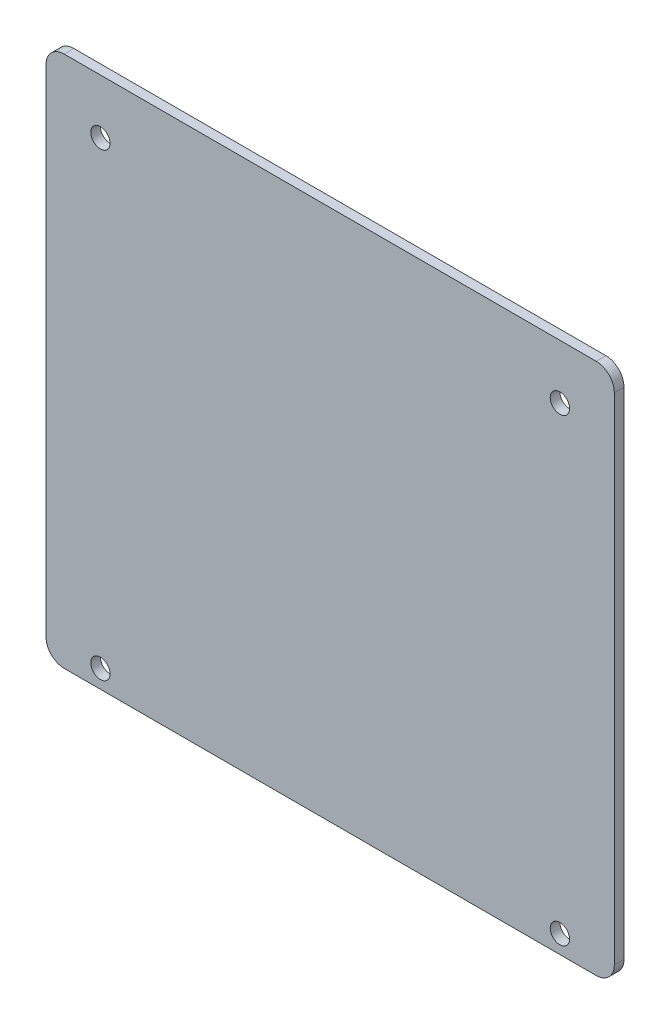
ISO-10303-21;
HEADER;
FILE_DESCRIPTION(('STEP AP214'),'2;1');
FILE_NAME('part.step','',(''),(''),'','','');
FILE_SCHEMA(('AUTOMOTIVE_DESIGN { 1 0 10303 214 1 1 1 1 }'));
ENDSEC;
DATA;
#1=APPLICATION_CONTEXT('core data for automotive mechanical design processes');
#2=APPLICATION_PROTOCOL_DEFINITION('international standard','automotive_design',2000,#1);
#3=PRODUCT_CONTEXT('',#1,'mechanical');
#4=PRODUCT('Part','Part','',(#3));
#5=PRODUCT_RELATED_PRODUCT_CATEGORY('part','',(#4));
#6=PRODUCT_DEFINITION_FORMATION('','',#4);
#7=PRODUCT_DEFINITION_CONTEXT('part definition',#1,'design');
#8=PRODUCT_DEFINITION('design','',#6,#7);
#9=PRODUCT_DEFINITION_SHAPE('','',#8);
#10=(LENGTH_UNIT() NAMED_UNIT(*) SI_UNIT(.MILLI.,.METRE.));
#11=(NAMED_UNIT(*) PLANE_ANGLE_UNIT() SI_UNIT($,.RADIAN.));
#12=(NAMED_UNIT(*) SI_UNIT($,.STERADIAN.) SOLID_ANGLE_UNIT());
#13=UNCERTAINTY_MEASURE_WITH_UNIT(LENGTH_MEASURE(1.E-05),#10,'distance_accuracy_value','');
#14=(GEOMETRIC_REPRESENTATION_CONTEXT(3) GLOBAL_UNCERTAINTY_ASSIGNED_CONTEXT((#13)) GLOBAL_UNIT_ASSIGNED_CONTEXT((#10,
#11,#12)) REPRESENTATION_CONTEXT('',''));
#15=CARTESIAN_POINT('',(0.,0.,0.));
#16=DIRECTION('',(0.,0.,1.));
#17=DIRECTION('',(1.,0.,0.));
#18=AXIS2_PLACEMENT_3D('',#15,#16,#17);
#19=CARTESIAN_POINT('',(-84.5653438799531,88.9518569300749,0.));
#20=DIRECTION('',(0.,0.,1.));
#21=DIRECTION('',(1.,0.,0.));
#22=AXIS2_PLACEMENT_3D('',#19,#20,#21);
#23=PLANE('',#22);
#24=CARTESIAN_POINT('',(-78.5653438799532,82.9518569300749,0.));
#25=DIRECTION('',(0.,0.,-1.));
#26=DIRECTION('',(-1.,0.,0.));
#27=AXIS2_PLACEMENT_3D('',#24,#25,#26);
#28=CIRCLE('',#27,1.59999999999999);
#29=CARTESIAN_POINT('',(-80.1653438799532,82.9518569300749,0.));
#30=VERTEX_POINT('',#29);
#31=EDGE_CURVE('E191',#30,#30,#28,.T.);
#32=ORIENTED_EDGE('',*,*,#31,.F.);
#33=EDGE_LOOP('',(#32));
#34=FACE_BOUND('',#33,.T.);
#35=CARTESIAN_POINT('',(-2.56534387995316,6.95185693007487,0.));
#36=DIRECTION('',(0.,0.,-1.));
#37=DIRECTION('',(-1.,0.,0.));
#38=AXIS2_PLACEMENT_3D('',#35,#36,#37);
#39=CIRCLE('',#38,1.59999999999999);
#40=CARTESIAN_POINT('',(-4.16534387995315,6.95185693007487,0.));
#41=VERTEX_POINT('',#40);
#42=EDGE_CURVE('E179',#41,#41,#39,.T.);
#43=ORIENTED_EDGE('',*,*,#42,.F.);
#44=EDGE_LOOP('',(#43));
#45=FACE_BOUND('',#44,.T.);
#46=CARTESIAN_POINT('',(-84.5653438799531,88.9518569300749,0.));
#47=DIRECTION('',(0.,0.,1.));
#48=DIRECTION('',(1.,0.,0.));
#49=AXIS2_PLACEMENT_3D('',#46,#47,#48);
#50=CIRCLE('',#49,3.);
#51=CARTESIAN_POINT('',(-84.5653438799531,91.9518569300749,0.));
#52=VERTEX_POINT('',#51);
#53=CARTESIAN_POINT('',(-87.5653438799531,88.9518569300748,0.));
#54=VERTEX_POINT('',#53);
#55=EDGE_CURVE('E129',#52,#54,#50,.T.);
#56=ORIENTED_EDGE('',*,*,#55,.F.);
#57=DIRECTION('',(-1.,0.,0.));
#58=VECTOR('',#57,1.);
#59=CARTESIAN_POINT('',(-84.5653438799531,91.9518569300749,0.));
#60=LINE('',#59,#58);
#61=CARTESIAN_POINT('',(3.43465612004681,91.9518569300749,0.));
#62=VERTEX_POINT('',#61);
#63=EDGE_CURVE('E84',#62,#52,#60,.T.);
#64=ORIENTED_EDGE('',*,*,#63,.F.);
#65=CARTESIAN_POINT('',(3.43465612004683,88.9518569300749,0.));
#66=DIRECTION('',(0.,0.,1.));
#67=DIRECTION('',(-1.,0.,0.));
#68=AXIS2_PLACEMENT_3D('',#65,#66,#67);
#69=CIRCLE('',#68,3.);
#70=CARTESIAN_POINT('',(6.43465612004683,88.9518569300748,0.));
#71=VERTEX_POINT('',#70);
#72=EDGE_CURVE('E78',#71,#62,#69,.T.);
#73=ORIENTED_EDGE('',*,*,#72,.F.);
#74=DIRECTION('',(0.,1.,0.));
#75=VECTOR('',#74,1.);
#76=CARTESIAN_POINT('',(6.43465612004683,88.9518569300748,0.));
#77=LINE('',#76,#75);
#78=CARTESIAN_POINT('',(6.43465612004684,6.9518569300749,0.));
#79=VERTEX_POINT('',#78);
#80=EDGE_CURVE('E119',#79,#71,#77,.T.);
#81=ORIENTED_EDGE('',*,*,#80,.F.);
#82=CARTESIAN_POINT('',(3.43465612004684,6.9518569300749,0.));
#83=DIRECTION('',(0.,0.,1.));
#84=DIRECTION('',(1.,0.,0.));
#85=AXIS2_PLACEMENT_3D('',#82,#83,#84);
#86=CIRCLE('',#85,3.);
#87=CARTESIAN_POINT('',(3.43465612004684,3.9518569300749,0.));
#88=VERTEX_POINT('',#87);
#89=EDGE_CURVE('E139',#88,#79,#86,.T.);
#90=ORIENTED_EDGE('',*,*,#89,.F.);
#91=DIRECTION('',(1.,0.,0.));
#92=VECTOR('',#91,1.);
#93=CARTESIAN_POINT('',(-84.5653438799531,3.9518569300749,0.));
#94=LINE('',#93,#92);
#95=CARTESIAN_POINT('',(-84.5653438799531,3.9518569300749,0.));
#96=VERTEX_POINT('',#95);
#97=EDGE_CURVE('E137',#96,#88,#94,.T.);
#98=ORIENTED_EDGE('',*,*,#97,.F.);
#99=CARTESIAN_POINT('',(-84.5653438799531,6.9518569300749,0.));
#100=DIRECTION('',(0.,0.,1.));
#101=DIRECTION('',(-1.,0.,0.));
#102=AXIS2_PLACEMENT_3D('',#99,#100,#101);
#103=CIRCLE('',#102,3.);
#104=CARTESIAN_POINT('',(-87.5653438799531,6.95185693007492,0.));
#105=VERTEX_POINT('',#104);
#106=EDGE_CURVE('E135',#105,#96,#103,.T.);
#107=ORIENTED_EDGE('',*,*,#106,.F.);
#108=DIRECTION('',(0.,-1.,0.));
#109=VECTOR('',#108,1.);
#110=CARTESIAN_POINT('',(-87.5653438799531,88.9518569300748,0.));
#111=LINE('',#110,#109);
#112=EDGE_CURVE('E132',#54,#105,#111,.T.);
#113=ORIENTED_EDGE('',*,*,#112,.F.);
#114=EDGE_LOOP('',(#56,#64,#73,#81,#90,#98,#107,#113));
#115=FACE_BOUND('',#114,.T.);
#116=CARTESIAN_POINT('',(-2.56534387995318,82.9518569300749,0.));
#117=DIRECTION('',(0.,0.,-1.));
#118=DIRECTION('',(-1.,0.,0.));
#119=AXIS2_PLACEMENT_3D('',#116,#117,#118);
#120=CIRCLE('',#119,1.59999999999999);
#121=CARTESIAN_POINT('',(-4.16534387995317,82.9518569300749,0.));
#122=VERTEX_POINT('',#121);
#123=EDGE_CURVE('E185',#122,#122,#120,.T.);
#124=ORIENTED_EDGE('',*,*,#123,.F.);
#125=EDGE_LOOP('',(#124));
#126=FACE_BOUND('',#125,.T.);
#127=CARTESIAN_POINT('',(-78.5653438799531,6.95185693007482,0.));
#128=DIRECTION('',(0.,0.,-1.));
#129=DIRECTION('',(-1.,0.,0.));
#130=AXIS2_PLACEMENT_3D('',#127,#128,#129);
#131=CIRCLE('',#130,1.59999999999999);
#132=CARTESIAN_POINT('',(-80.1653438799531,6.95185693007482,0.));
#133=VERTEX_POINT('',#132);
#134=EDGE_CURVE('E197',#133,#133,#131,.T.);
#135=ORIENTED_EDGE('',*,*,#134,.F.);
#136=EDGE_LOOP('',(#135));
#137=FACE_BOUND('',#136,.T.);
#138=ADVANCED_FACE('F32',(#34,#45,#115,#126,#137),#23,.F.);
#139=CARTESIAN_POINT('',(-84.5653438799531,88.9518569300749,1.6));
#140=DIRECTION('',(0.,0.,-1.));
#141=DIRECTION('',(-1.,0.,0.));
#142=AXIS2_PLACEMENT_3D('',#139,#140,#141);
#143=CYLINDRICAL_SURFACE('',#142,3.);
#144=ORIENTED_EDGE('',*,*,#55,.T.);
#145=DIRECTION('',(0.,0.,-1.));
#146=VECTOR('',#145,1.);
#147=CARTESIAN_POINT('',(-87.5653438799531,88.9518569300748,1.6));
#148=LINE('',#147,#146);
#149=CARTESIAN_POINT('',(-87.5653438799531,88.9518569300748,1.6));
#150=VERTEX_POINT('',#149);
#151=EDGE_CURVE('E11',#150,#54,#148,.T.);
#152=ORIENTED_EDGE('',*,*,#151,.F.);
#153=CARTESIAN_POINT('',(-84.5653438799531,88.9518569300749,1.6));
#154=DIRECTION('',(0.,0.,1.));
#155=DIRECTION('',(1.,0.,0.));
#156=AXIS2_PLACEMENT_3D('',#153,#154,#155);
#157=CIRCLE('',#156,3.);
#158=CARTESIAN_POINT('',(-84.5653438799531,91.9518569300749,1.6));
#159=VERTEX_POINT('',#158);
#160=EDGE_CURVE('E144',#159,#150,#157,.T.);
#161=ORIENTED_EDGE('',*,*,#160,.F.);
#162=DIRECTION('',(0.,0.,-1.));
#163=VECTOR('',#162,1.);
#164=CARTESIAN_POINT('',(-84.5653438799531,91.9518569300749,1.6));
#165=LINE('',#164,#163);
#166=EDGE_CURVE('E125',#159,#52,#165,.T.);
#167=ORIENTED_EDGE('',*,*,#166,.T.);
#168=EDGE_LOOP('',(#144,#152,#161,#167));
#169=FACE_BOUND('',#168,.T.);
#170=ADVANCED_FACE('F34',(#169),#143,.T.);
#171=CARTESIAN_POINT('',(-87.5653438799531,88.9518569300748,1.6));
#172=DIRECTION('',(1.,0.,0.));
#173=DIRECTION('',(0.,0.,-1.));
#174=AXIS2_PLACEMENT_3D('',#171,#172,#173);
#175=PLANE('',#174);
#176=ORIENTED_EDGE('',*,*,#112,.T.);
#177=DIRECTION('',(0.,0.,-1.));
#178=VECTOR('',#177,1.);
#179=CARTESIAN_POINT('',(-87.5653438799531,6.95185693007492,1.6));
#180=LINE('',#179,#178);
#181=CARTESIAN_POINT('',(-87.5653438799531,6.95185693007492,1.6));
#182=VERTEX_POINT('',#181);
#183=EDGE_CURVE('E41',#182,#105,#180,.T.);
#184=ORIENTED_EDGE('',*,*,#183,.F.);
#185=DIRECTION('',(0.,-1.,0.));
#186=VECTOR('',#185,1.);
#187=CARTESIAN_POINT('',(-87.5653438799531,88.9518569300748,1.6));
#188=LINE('',#187,#186);
#189=EDGE_CURVE('E92',#150,#182,#188,.T.);
#190=ORIENTED_EDGE('',*,*,#189,.F.);
#191=ORIENTED_EDGE('',*,*,#151,.T.);
#192=EDGE_LOOP('',(#176,#184,#190,#191));
#193=FACE_BOUND('',#192,.T.);
#194=ADVANCED_FACE('F210',(#193),#175,.F.);
#195=CARTESIAN_POINT('',(-84.5653438799531,6.9518569300749,1.6));
#196=DIRECTION('',(0.,0.,-1.));
#197=DIRECTION('',(-1.,0.,0.));
#198=AXIS2_PLACEMENT_3D('',#195,#196,#197);
#199=CYLINDRICAL_SURFACE('',#198,3.);
#200=ORIENTED_EDGE('',*,*,#106,.T.);
#201=DIRECTION('',(0.,0.,-1.));
#202=VECTOR('',#201,1.);
#203=CARTESIAN_POINT('',(-84.5653438799531,3.9518569300749,1.6));
#204=LINE('',#203,#202);
#205=CARTESIAN_POINT('',(-84.5653438799531,3.9518569300749,1.6));
#206=VERTEX_POINT('',#205);
#207=EDGE_CURVE('E151',#206,#96,#204,.T.);
#208=ORIENTED_EDGE('',*,*,#207,.F.);
#209=CARTESIAN_POINT('',(-84.5653438799531,6.9518569300749,1.6));
#210=DIRECTION('',(0.,0.,1.));
#211=DIRECTION('',(-1.,0.,0.));
#212=AXIS2_PLACEMENT_3D('',#209,#210,#211);
#213=CIRCLE('',#212,3.);
#214=EDGE_CURVE('E159',#182,#206,#213,.T.);
#215=ORIENTED_EDGE('',*,*,#214,.F.);
#216=ORIENTED_EDGE('',*,*,#183,.T.);
#217=EDGE_LOOP('',(#200,#208,#215,#216));
#218=FACE_BOUND('',#217,.T.);
#219=ADVANCED_FACE('F157',(#218),#199,.T.);
#220=CARTESIAN_POINT('',(-84.5653438799531,3.9518569300749,1.6));
#221=DIRECTION('',(0.,1.,0.));
#222=DIRECTION('',(-1.,0.,0.));
#223=AXIS2_PLACEMENT_3D('',#220,#221,#222);
#224=PLANE('',#223);
#225=ORIENTED_EDGE('',*,*,#97,.T.);
#226=DIRECTION('',(0.,0.,-1.));
#227=VECTOR('',#226,1.);
#228=CARTESIAN_POINT('',(3.43465612004684,3.9518569300749,1.6));
#229=LINE('',#228,#227);
#230=CARTESIAN_POINT('',(3.43465612004684,3.9518569300749,1.6));
#231=VERTEX_POINT('',#230);
#232=EDGE_CURVE('E148',#231,#88,#229,.T.);
#233=ORIENTED_EDGE('',*,*,#232,.F.);
#234=DIRECTION('',(1.,0.,0.));
#235=VECTOR('',#234,1.);
#236=CARTESIAN_POINT('',(-84.5653438799531,3.9518569300749,1.6));
#237=LINE('',#236,#235);
#238=EDGE_CURVE('E171',#206,#231,#237,.T.);
#239=ORIENTED_EDGE('',*,*,#238,.F.);
#240=ORIENTED_EDGE('',*,*,#207,.T.);
#241=EDGE_LOOP('',(#225,#233,#239,#240));
#242=FACE_BOUND('',#241,.T.);
#243=ADVANCED_FACE('F167',(#242),#224,.F.);
#244=CARTESIAN_POINT('',(3.43465612004684,6.9518569300749,1.6));
#245=DIRECTION('',(0.,0.,-1.));
#246=DIRECTION('',(-1.,0.,0.));
#247=AXIS2_PLACEMENT_3D('',#244,#245,#246);
#248=CYLINDRICAL_SURFACE('',#247,3.);
#249=ORIENTED_EDGE('',*,*,#89,.T.);
#250=DIRECTION('',(0.,0.,-1.));
#251=VECTOR('',#250,1.);
#252=CARTESIAN_POINT('',(6.43465612004684,6.9518569300749,1.6));
#253=LINE('',#252,#251);
#254=CARTESIAN_POINT('',(6.43465612004684,6.9518569300749,1.6));
#255=VERTEX_POINT('',#254);
#256=EDGE_CURVE('E120',#255,#79,#253,.T.);
#257=ORIENTED_EDGE('',*,*,#256,.F.);
#258=CARTESIAN_POINT('',(3.43465612004684,6.9518569300749,1.6));
#259=DIRECTION('',(0.,0.,1.));
#260=DIRECTION('',(1.,0.,0.));
#261=AXIS2_PLACEMENT_3D('',#258,#259,#260);
#262=CIRCLE('',#261,3.);
#263=EDGE_CURVE('E111',#231,#255,#262,.T.);
#264=ORIENTED_EDGE('',*,*,#263,.F.);
#265=ORIENTED_EDGE('',*,*,#232,.T.);
#266=EDGE_LOOP('',(#249,#257,#264,#265));
#267=FACE_BOUND('',#266,.T.);
#268=ADVANCED_FACE('F170',(#267),#248,.T.);
#269=CARTESIAN_POINT('',(6.43465612004683,88.9518569300748,1.6));
#270=DIRECTION('',(-1.,0.,0.));
#271=DIRECTION('',(0.,-1.,0.));
#272=AXIS2_PLACEMENT_3D('',#269,#270,#271);
#273=PLANE('',#272);
#274=ORIENTED_EDGE('',*,*,#80,.T.);
#275=DIRECTION('',(0.,0.,-1.));
#276=VECTOR('',#275,1.);
#277=CARTESIAN_POINT('',(6.43465612004683,88.9518569300748,1.6));
#278=LINE('',#277,#276);
#279=CARTESIAN_POINT('',(6.43465612004683,88.9518569300748,1.6));
#280=VERTEX_POINT('',#279);
#281=EDGE_CURVE('E116',#280,#71,#278,.T.);
#282=ORIENTED_EDGE('',*,*,#281,.F.);
#283=DIRECTION('',(0.,1.,0.));
#284=VECTOR('',#283,1.);
#285=CARTESIAN_POINT('',(6.43465612004683,88.9518569300748,1.6));
#286=LINE('',#285,#284);
#287=EDGE_CURVE('E105',#255,#280,#286,.T.);
#288=ORIENTED_EDGE('',*,*,#287,.F.);
#289=ORIENTED_EDGE('',*,*,#256,.T.);
#290=EDGE_LOOP('',(#274,#282,#288,#289));
#291=FACE_BOUND('',#290,.T.);
#292=ADVANCED_FACE('F117',(#291),#273,.F.);
#293=CARTESIAN_POINT('',(3.43465612004683,88.9518569300749,1.6));
#294=DIRECTION('',(0.,0.,-1.));
#295=DIRECTION('',(-1.,0.,0.));
#296=AXIS2_PLACEMENT_3D('',#293,#294,#295);
#297=CYLINDRICAL_SURFACE('',#296,3.);
#298=ORIENTED_EDGE('',*,*,#72,.T.);
#299=DIRECTION('',(0.,0.,-1.));
#300=VECTOR('',#299,1.);
#301=CARTESIAN_POINT('',(3.43465612004681,91.9518569300749,1.6));
#302=LINE('',#301,#300);
#303=CARTESIAN_POINT('',(3.43465612004681,91.9518569300749,1.6));
#304=VERTEX_POINT('',#303);
#305=EDGE_CURVE('E121',#304,#62,#302,.T.);
#306=ORIENTED_EDGE('',*,*,#305,.F.);
#307=CARTESIAN_POINT('',(3.43465612004683,88.9518569300749,1.6));
#308=DIRECTION('',(0.,0.,1.));
#309=DIRECTION('',(-1.,0.,0.));
#310=AXIS2_PLACEMENT_3D('',#307,#308,#309);
#311=CIRCLE('',#310,3.);
#312=EDGE_CURVE('E109',#280,#304,#311,.T.);
#313=ORIENTED_EDGE('',*,*,#312,.F.);
#314=ORIENTED_EDGE('',*,*,#281,.T.);
#315=EDGE_LOOP('',(#298,#306,#313,#314));
#316=FACE_BOUND('',#315,.T.);
#317=ADVANCED_FACE('F123',(#316),#297,.T.);
#318=CARTESIAN_POINT('',(-84.5653438799531,91.9518569300749,1.6));
#319=DIRECTION('',(0.,-1.,0.));
#320=DIRECTION('',(0.,0.,-1.));
#321=AXIS2_PLACEMENT_3D('',#318,#319,#320);
#322=PLANE('',#321);
#323=ORIENTED_EDGE('',*,*,#63,.T.);
#324=ORIENTED_EDGE('',*,*,#166,.F.);
#325=DIRECTION('',(-1.,0.,0.));
#326=VECTOR('',#325,1.);
#327=CARTESIAN_POINT('',(-84.5653438799531,91.9518569300749,1.6));
#328=LINE('',#327,#326);
#329=EDGE_CURVE('E49',#304,#159,#328,.T.);
#330=ORIENTED_EDGE('',*,*,#329,.F.);
#331=ORIENTED_EDGE('',*,*,#305,.T.);
#332=EDGE_LOOP('',(#323,#324,#330,#331));
#333=FACE_BOUND('',#332,.T.);
#334=ADVANCED_FACE('F217',(#333),#322,.F.);
#335=CARTESIAN_POINT('',(-84.5653438799531,88.9518569300749,1.6));
#336=DIRECTION('',(0.,0.,1.));
#337=DIRECTION('',(1.,0.,0.));
#338=AXIS2_PLACEMENT_3D('',#335,#336,#337);
#339=PLANE('',#338);
#340=CARTESIAN_POINT('',(-78.5653438799531,6.95185693007482,1.6));
#341=DIRECTION('',(0.,0.,1.));
#342=DIRECTION('',(1.,0.,0.));
#343=AXIS2_PLACEMENT_3D('',#340,#341,#342);
#344=CIRCLE('',#343,1.6);
#345=CARTESIAN_POINT('',(-76.9653438799532,6.95185693007482,1.6));
#346=VERTEX_POINT('',#345);
#347=EDGE_CURVE('E194',#346,#346,#344,.T.);
#348=ORIENTED_EDGE('',*,*,#347,.F.);
#349=EDGE_LOOP('',(#348));
#350=FACE_BOUND('',#349,.T.);
#351=CARTESIAN_POINT('',(-78.5653438799532,82.9518569300749,1.6));
#352=DIRECTION('',(0.,0.,1.));
#353=DIRECTION('',(1.,0.,0.));
#354=AXIS2_PLACEMENT_3D('',#351,#352,#353);
#355=CIRCLE('',#354,1.6);
#356=CARTESIAN_POINT('',(-76.9653438799532,82.9518569300749,1.6));
#357=VERTEX_POINT('',#356);
#358=EDGE_CURVE('E188',#357,#357,#355,.T.);
#359=ORIENTED_EDGE('',*,*,#358,.F.);
#360=EDGE_LOOP('',(#359));
#361=FACE_BOUND('',#360,.T.);
#362=CARTESIAN_POINT('',(-2.56534387995318,82.9518569300749,1.6));
#363=DIRECTION('',(0.,0.,1.));
#364=DIRECTION('',(1.,0.,0.));
#365=AXIS2_PLACEMENT_3D('',#362,#363,#364);
#366=CIRCLE('',#365,1.59999999999999);
#367=CARTESIAN_POINT('',(-0.965343879953191,82.9518569300749,1.6));
#368=VERTEX_POINT('',#367);
#369=EDGE_CURVE('E182',#368,#368,#366,.T.);
#370=ORIENTED_EDGE('',*,*,#369,.F.);
#371=EDGE_LOOP('',(#370));
#372=FACE_BOUND('',#371,.T.);
#373=CARTESIAN_POINT('',(-2.56534387995316,6.95185693007487,1.6));
#374=DIRECTION('',(0.,0.,1.));
#375=DIRECTION('',(1.,0.,0.));
#376=AXIS2_PLACEMENT_3D('',#373,#374,#375);
#377=CIRCLE('',#376,1.59999999999999);
#378=CARTESIAN_POINT('',(-0.96534387995317,6.95185693007487,1.6));
#379=VERTEX_POINT('',#378);
#380=EDGE_CURVE('E133',#379,#379,#377,.T.);
#381=ORIENTED_EDGE('',*,*,#380,.F.);
#382=EDGE_LOOP('',(#381));
#383=FACE_BOUND('',#382,.T.);
#384=ORIENTED_EDGE('',*,*,#160,.T.);
#385=ORIENTED_EDGE('',*,*,#189,.T.);
#386=ORIENTED_EDGE('',*,*,#214,.T.);
#387=ORIENTED_EDGE('',*,*,#238,.T.);
#388=ORIENTED_EDGE('',*,*,#263,.T.);
#389=ORIENTED_EDGE('',*,*,#287,.T.);
#390=ORIENTED_EDGE('',*,*,#312,.T.);
#391=ORIENTED_EDGE('',*,*,#329,.T.);
#392=EDGE_LOOP('',(#384,#385,#386,#387,#388,#389,#390,#391));
#393=FACE_BOUND('',#392,.T.);
#394=ADVANCED_FACE('F107',(#350,#361,#372,#383,#393),#339,.T.);
#395=CARTESIAN_POINT('',(-2.56534387995316,6.95185693007487,0.));
#396=DIRECTION('',(0.,0.,-1.));
#397=DIRECTION('',(-1.,0.,0.));
#398=AXIS2_PLACEMENT_3D('',#395,#396,#397);
#399=CYLINDRICAL_SURFACE('',#398,1.59999999999999);
#400=ORIENTED_EDGE('',*,*,#42,.T.);
#401=EDGE_LOOP('',(#400));
#402=FACE_BOUND('',#401,.T.);
#403=ORIENTED_EDGE('',*,*,#380,.T.);
#404=EDGE_LOOP('',(#403));
#405=FACE_BOUND('',#404,.T.);
#406=ADVANCED_FACE('F266',(#402,#405),#399,.F.);
#407=CARTESIAN_POINT('',(-2.56534387995318,82.9518569300749,0.));
#408=DIRECTION('',(0.,0.,-1.));
#409=DIRECTION('',(-1.,0.,0.));
#410=AXIS2_PLACEMENT_3D('',#407,#408,#409);
#411=CYLINDRICAL_SURFACE('',#410,1.59999999999999);
#412=ORIENTED_EDGE('',*,*,#123,.T.);
#413=EDGE_LOOP('',(#412));
#414=FACE_BOUND('',#413,.T.);
#415=ORIENTED_EDGE('',*,*,#369,.T.);
#416=EDGE_LOOP('',(#415));
#417=FACE_BOUND('',#416,.T.);
#418=ADVANCED_FACE('F273',(#414,#417),#411,.F.);
#419=CARTESIAN_POINT('',(-78.5653438799532,82.9518569300749,0.));
#420=DIRECTION('',(0.,0.,-1.));
#421=DIRECTION('',(-1.,0.,0.));
#422=AXIS2_PLACEMENT_3D('',#419,#420,#421);
#423=CYLINDRICAL_SURFACE('',#422,1.6);
#424=ORIENTED_EDGE('',*,*,#31,.T.);
#425=EDGE_LOOP('',(#424));
#426=FACE_BOUND('',#425,.T.);
#427=ORIENTED_EDGE('',*,*,#358,.T.);
#428=EDGE_LOOP('',(#427));
#429=FACE_BOUND('',#428,.T.);
#430=ADVANCED_FACE('F280',(#426,#429),#423,.F.);
#431=CARTESIAN_POINT('',(-78.5653438799531,6.95185693007482,0.));
#432=DIRECTION('',(0.,0.,-1.));
#433=DIRECTION('',(-1.,0.,0.));
#434=AXIS2_PLACEMENT_3D('',#431,#432,#433);
#435=CYLINDRICAL_SURFACE('',#434,1.6);
#436=ORIENTED_EDGE('',*,*,#134,.T.);
#437=EDGE_LOOP('',(#436));
#438=FACE_BOUND('',#437,.T.);
#439=ORIENTED_EDGE('',*,*,#347,.T.);
#440=EDGE_LOOP('',(#439));
#441=FACE_BOUND('',#440,.T.);
#442=ADVANCED_FACE('F201',(#438,#441),#435,.F.);
#443=CLOSED_SHELL('',(#138,#170,#194,#219,#243,#268,#292,#317,#334,#394,#406,#418,#430,#442));
#444=MANIFOLD_SOLID_BREP('B2',#443);
#445=ADVANCED_BREP_SHAPE_REPRESENTATION('',(#18,#444),#14);
#446=SHAPE_DEFINITION_REPRESENTATION(#9,#445);
ENDSEC;
END-ISO-10303-21;
